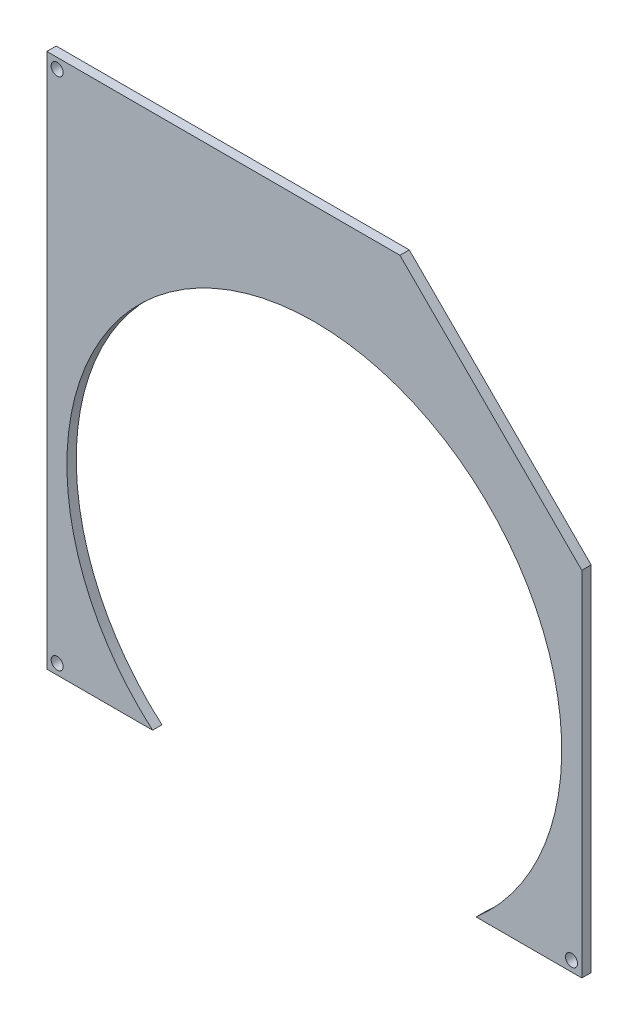
ISO-10303-21;
HEADER;
FILE_DESCRIPTION(('STEP AP214'),'2;1');
FILE_NAME('part.step','',(''),(''),'','','');
FILE_SCHEMA(('AUTOMOTIVE_DESIGN { 1 0 10303 214 1 1 1 1 }'));
ENDSEC;
DATA;
#1=APPLICATION_CONTEXT('core data for automotive mechanical design processes');
#2=APPLICATION_PROTOCOL_DEFINITION('international standard','automotive_design',2000,#1);
#3=PRODUCT_CONTEXT('',#1,'mechanical');
#4=PRODUCT('Part','Part','',(#3));
#5=PRODUCT_RELATED_PRODUCT_CATEGORY('part','',(#4));
#6=PRODUCT_DEFINITION_FORMATION('','',#4);
#7=PRODUCT_DEFINITION_CONTEXT('part definition',#1,'design');
#8=PRODUCT_DEFINITION('design','',#6,#7);
#9=PRODUCT_DEFINITION_SHAPE('','',#8);
#10=(LENGTH_UNIT() NAMED_UNIT(*) SI_UNIT(.MILLI.,.METRE.));
#11=(NAMED_UNIT(*) PLANE_ANGLE_UNIT() SI_UNIT($,.RADIAN.));
#12=(NAMED_UNIT(*) SI_UNIT($,.STERADIAN.) SOLID_ANGLE_UNIT());
#13=UNCERTAINTY_MEASURE_WITH_UNIT(LENGTH_MEASURE(1.E-05),#10,'distance_accuracy_value','');
#14=(GEOMETRIC_REPRESENTATION_CONTEXT(3) GLOBAL_UNCERTAINTY_ASSIGNED_CONTEXT((#13)) GLOBAL_UNIT_ASSIGNED_CONTEXT((#10,
#11,#12)) REPRESENTATION_CONTEXT('',''));
#15=CARTESIAN_POINT('',(0.,0.,0.));
#16=DIRECTION('',(0.,0.,1.));
#17=DIRECTION('',(1.,0.,0.));
#18=AXIS2_PLACEMENT_3D('',#15,#16,#17);
#19=CARTESIAN_POINT('',(0.,-30.,3.5));
#20=DIRECTION('',(0.,0.,-1.));
#21=DIRECTION('',(-1.,0.,0.));
#22=AXIS2_PLACEMENT_3D('',#19,#20,#21);
#23=CYLINDRICAL_SURFACE('',#22,92.5);
#24=CARTESIAN_POINT('',(0.,-30.,0.));
#25=DIRECTION('',(0.,0.,1.));
#26=DIRECTION('',(1.,0.,0.));
#27=AXIS2_PLACEMENT_3D('',#24,#25,#26);
#28=CIRCLE('',#27,92.5);
#29=CARTESIAN_POINT('',(60.4669331122391,-100.,0.));
#30=VERTEX_POINT('',#29);
#31=CARTESIAN_POINT('',(-60.4669331122391,-100.,0.));
#32=VERTEX_POINT('',#31);
#33=EDGE_CURVE('E134',#30,#32,#28,.T.);
#34=ORIENTED_EDGE('',*,*,#33,.F.);
#35=DIRECTION('',(0.,0.,-1.));
#36=VECTOR('',#35,1.);
#37=CARTESIAN_POINT('',(60.4669331122391,-100.,3.5));
#38=LINE('',#37,#36);
#39=CARTESIAN_POINT('',(60.4669331122391,-100.,3.5));
#40=VERTEX_POINT('',#39);
#41=EDGE_CURVE('E11',#40,#30,#38,.T.);
#42=ORIENTED_EDGE('',*,*,#41,.F.);
#43=CARTESIAN_POINT('',(0.,-30.,3.5));
#44=DIRECTION('',(0.,0.,1.));
#45=DIRECTION('',(1.,0.,0.));
#46=AXIS2_PLACEMENT_3D('',#43,#44,#45);
#47=CIRCLE('',#46,92.5);
#48=CARTESIAN_POINT('',(-60.4669331122391,-100.,3.5));
#49=VERTEX_POINT('',#48);
#50=EDGE_CURVE('E158',#40,#49,#47,.T.);
#51=ORIENTED_EDGE('',*,*,#50,.T.);
#52=DIRECTION('',(0.,0.,-1.));
#53=VECTOR('',#52,1.);
#54=CARTESIAN_POINT('',(-60.4669331122391,-100.,3.5));
#55=LINE('',#54,#53);
#56=EDGE_CURVE('E83',#49,#32,#55,.T.);
#57=ORIENTED_EDGE('',*,*,#56,.T.);
#58=EDGE_LOOP('',(#34,#42,#51,#57));
#59=FACE_BOUND('',#58,.T.);
#60=ADVANCED_FACE('F36',(#59),#23,.F.);
#61=CARTESIAN_POINT('',(0.,-100.,3.5));
#62=DIRECTION('',(0.,1.,0.));
#63=DIRECTION('',(0.,0.,1.));
#64=AXIS2_PLACEMENT_3D('',#61,#62,#63);
#65=PLANE('',#64);
#66=DIRECTION('',(1.,0.,0.));
#67=VECTOR('',#66,1.);
#68=CARTESIAN_POINT('',(0.,-100.,0.));
#69=LINE('',#68,#67);
#70=CARTESIAN_POINT('',(100.,-100.,0.));
#71=VERTEX_POINT('',#70);
#72=EDGE_CURVE('E137',#30,#71,#69,.T.);
#73=ORIENTED_EDGE('',*,*,#72,.T.);
#74=DIRECTION('',(0.,0.,-1.));
#75=VECTOR('',#74,1.);
#76=CARTESIAN_POINT('',(100.,-100.,3.5));
#77=LINE('',#76,#75);
#78=CARTESIAN_POINT('',(100.,-100.,3.5));
#79=VERTEX_POINT('',#78);
#80=EDGE_CURVE('E44',#79,#71,#77,.T.);
#81=ORIENTED_EDGE('',*,*,#80,.F.);
#82=DIRECTION('',(1.,0.,0.));
#83=VECTOR('',#82,1.);
#84=CARTESIAN_POINT('',(0.,-100.,3.5));
#85=LINE('',#84,#83);
#86=EDGE_CURVE('E123',#40,#79,#85,.T.);
#87=ORIENTED_EDGE('',*,*,#86,.F.);
#88=ORIENTED_EDGE('',*,*,#41,.T.);
#89=EDGE_LOOP('',(#73,#81,#87,#88));
#90=FACE_BOUND('',#89,.T.);
#91=ADVANCED_FACE('F181',(#90),#65,.F.);
#92=CARTESIAN_POINT('',(100.,0.,3.5));
#93=DIRECTION('',(-1.,0.,0.));
#94=DIRECTION('',(0.,0.,1.));
#95=AXIS2_PLACEMENT_3D('',#92,#93,#94);
#96=PLANE('',#95);
#97=DIRECTION('',(0.,1.,0.));
#98=VECTOR('',#97,1.);
#99=CARTESIAN_POINT('',(100.,0.,0.));
#100=LINE('',#99,#98);
#101=CARTESIAN_POINT('',(100.,31.9999999999993,0.));
#102=VERTEX_POINT('',#101);
#103=EDGE_CURVE('E139',#71,#102,#100,.T.);
#104=ORIENTED_EDGE('',*,*,#103,.T.);
#105=DIRECTION('',(0.,0.,-1.));
#106=VECTOR('',#105,1.);
#107=CARTESIAN_POINT('',(100.,31.9999999999993,3.5));
#108=LINE('',#107,#106);
#109=CARTESIAN_POINT('',(100.,31.9999999999993,3.5));
#110=VERTEX_POINT('',#109);
#111=EDGE_CURVE('E162',#110,#102,#108,.T.);
#112=ORIENTED_EDGE('',*,*,#111,.F.);
#113=DIRECTION('',(0.,1.,0.));
#114=VECTOR('',#113,1.);
#115=CARTESIAN_POINT('',(100.,0.,3.5));
#116=LINE('',#115,#114);
#117=EDGE_CURVE('E170',#79,#110,#116,.T.);
#118=ORIENTED_EDGE('',*,*,#117,.F.);
#119=ORIENTED_EDGE('',*,*,#80,.T.);
#120=EDGE_LOOP('',(#104,#112,#118,#119));
#121=FACE_BOUND('',#120,.T.);
#122=ADVANCED_FACE('F168',(#121),#96,.F.);
#123=CARTESIAN_POINT('',(66.0000000000002,65.9999999999995,3.5));
#124=DIRECTION('',(0.707106781186551,0.707106781186544,0.));
#125=DIRECTION('',(-0.707106781186544,0.707106781186551,0.));
#126=AXIS2_PLACEMENT_3D('',#123,#124,#125);
#127=PLANE('',#126);
#128=DIRECTION('',(0.707106781186544,-0.707106781186551,0.));
#129=VECTOR('',#128,1.);
#130=CARTESIAN_POINT('',(66.0000000000002,65.9999999999995,0.));
#131=LINE('',#130,#129);
#132=CARTESIAN_POINT('',(32.,100.,0.));
#133=VERTEX_POINT('',#132);
#134=EDGE_CURVE('E143',#133,#102,#131,.T.);
#135=ORIENTED_EDGE('',*,*,#134,.F.);
#136=DIRECTION('',(0.,0.,-1.));
#137=VECTOR('',#136,1.);
#138=CARTESIAN_POINT('',(32.,100.,3.5));
#139=LINE('',#138,#137);
#140=CARTESIAN_POINT('',(32.,100.,3.5));
#141=VERTEX_POINT('',#140);
#142=EDGE_CURVE('E110',#141,#133,#139,.T.);
#143=ORIENTED_EDGE('',*,*,#142,.F.);
#144=DIRECTION('',(0.707106781186544,-0.707106781186551,0.));
#145=VECTOR('',#144,1.);
#146=CARTESIAN_POINT('',(66.0000000000002,65.9999999999995,3.5));
#147=LINE('',#146,#145);
#148=EDGE_CURVE('E117',#141,#110,#147,.T.);
#149=ORIENTED_EDGE('',*,*,#148,.T.);
#150=ORIENTED_EDGE('',*,*,#111,.T.);
#151=EDGE_LOOP('',(#135,#143,#149,#150));
#152=FACE_BOUND('',#151,.T.);
#153=ADVANCED_FACE('F178',(#152),#127,.T.);
#154=CARTESIAN_POINT('',(0.,100.,3.5));
#155=DIRECTION('',(0.,1.,0.));
#156=DIRECTION('',(0.,0.,1.));
#157=AXIS2_PLACEMENT_3D('',#154,#155,#156);
#158=PLANE('',#157);
#159=DIRECTION('',(1.,0.,0.));
#160=VECTOR('',#159,1.);
#161=CARTESIAN_POINT('',(0.,100.,0.));
#162=LINE('',#161,#160);
#163=CARTESIAN_POINT('',(-100.,100.,0.));
#164=VERTEX_POINT('',#163);
#165=EDGE_CURVE('E105',#164,#133,#162,.T.);
#166=ORIENTED_EDGE('',*,*,#165,.F.);
#167=DIRECTION('',(0.,0.,-1.));
#168=VECTOR('',#167,1.);
#169=CARTESIAN_POINT('',(-100.,100.,3.5));
#170=LINE('',#169,#168);
#171=CARTESIAN_POINT('',(-100.,100.,3.5));
#172=VERTEX_POINT('',#171);
#173=EDGE_CURVE('E100',#172,#164,#170,.T.);
#174=ORIENTED_EDGE('',*,*,#173,.F.);
#175=DIRECTION('',(1.,0.,0.));
#176=VECTOR('',#175,1.);
#177=CARTESIAN_POINT('',(0.,100.,3.5));
#178=LINE('',#177,#176);
#179=EDGE_CURVE('E103',#172,#141,#178,.T.);
#180=ORIENTED_EDGE('',*,*,#179,.T.);
#181=ORIENTED_EDGE('',*,*,#142,.T.);
#182=EDGE_LOOP('',(#166,#174,#180,#181));
#183=FACE_BOUND('',#182,.T.);
#184=ADVANCED_FACE('F102',(#183),#158,.T.);
#185=CARTESIAN_POINT('',(-100.,0.,3.5));
#186=DIRECTION('',(-1.,0.,0.));
#187=DIRECTION('',(0.,0.,1.));
#188=AXIS2_PLACEMENT_3D('',#185,#186,#187);
#189=PLANE('',#188);
#190=DIRECTION('',(0.,1.,0.));
#191=VECTOR('',#190,1.);
#192=CARTESIAN_POINT('',(-100.,0.,0.));
#193=LINE('',#192,#191);
#194=CARTESIAN_POINT('',(-100.,-100.,0.));
#195=VERTEX_POINT('',#194);
#196=EDGE_CURVE('E147',#195,#164,#193,.T.);
#197=ORIENTED_EDGE('',*,*,#196,.F.);
#198=DIRECTION('',(0.,0.,-1.));
#199=VECTOR('',#198,1.);
#200=CARTESIAN_POINT('',(-100.,-100.,3.5));
#201=LINE('',#200,#199);
#202=CARTESIAN_POINT('',(-100.,-100.,3.5));
#203=VERTEX_POINT('',#202);
#204=EDGE_CURVE('E76',#203,#195,#201,.T.);
#205=ORIENTED_EDGE('',*,*,#204,.F.);
#206=DIRECTION('',(0.,1.,0.));
#207=VECTOR('',#206,1.);
#208=CARTESIAN_POINT('',(-100.,0.,3.5));
#209=LINE('',#208,#207);
#210=EDGE_CURVE('E115',#203,#172,#209,.T.);
#211=ORIENTED_EDGE('',*,*,#210,.T.);
#212=ORIENTED_EDGE('',*,*,#173,.T.);
#213=EDGE_LOOP('',(#197,#205,#211,#212));
#214=FACE_BOUND('',#213,.T.);
#215=ADVANCED_FACE('F119',(#214),#189,.T.);
#216=CARTESIAN_POINT('',(96.1500000000001,-96.15,3.5));
#217=DIRECTION('',(0.,0.,-1.));
#218=DIRECTION('',(-1.,0.,0.));
#219=AXIS2_PLACEMENT_3D('',#216,#217,#218);
#220=CYLINDRICAL_SURFACE('',#219,2.25);
#221=CARTESIAN_POINT('',(96.1500000000001,-96.15,3.5));
#222=DIRECTION('',(0.,0.,1.));
#223=DIRECTION('',(1.,0.,0.));
#224=AXIS2_PLACEMENT_3D('',#221,#222,#223);
#225=CIRCLE('',#224,2.25);
#226=CARTESIAN_POINT('',(98.4000000000001,-96.15,3.5));
#227=VERTEX_POINT('',#226);
#228=EDGE_CURVE('E128',#227,#227,#225,.T.);
#229=ORIENTED_EDGE('',*,*,#228,.T.);
#230=EDGE_LOOP('',(#229));
#231=FACE_BOUND('',#230,.T.);
#232=CARTESIAN_POINT('',(96.1500000000001,-96.15,0.));
#233=DIRECTION('',(0.,0.,1.));
#234=DIRECTION('',(1.,0.,0.));
#235=AXIS2_PLACEMENT_3D('',#232,#233,#234);
#236=CIRCLE('',#235,2.25);
#237=CARTESIAN_POINT('',(98.4000000000001,-96.15,0.));
#238=VERTEX_POINT('',#237);
#239=EDGE_CURVE('E152',#238,#238,#236,.T.);
#240=ORIENTED_EDGE('',*,*,#239,.F.);
#241=EDGE_LOOP('',(#240));
#242=FACE_BOUND('',#241,.T.);
#243=ADVANCED_FACE('F200',(#231,#242),#220,.F.);
#244=CARTESIAN_POINT('',(-96.15,96.15,3.5));
#245=DIRECTION('',(0.,0.,-1.));
#246=DIRECTION('',(-1.,0.,0.));
#247=AXIS2_PLACEMENT_3D('',#244,#245,#246);
#248=CYLINDRICAL_SURFACE('',#247,2.25);
#249=CARTESIAN_POINT('',(-96.15,96.15,3.5));
#250=DIRECTION('',(0.,0.,1.));
#251=DIRECTION('',(1.,0.,0.));
#252=AXIS2_PLACEMENT_3D('',#249,#250,#251);
#253=CIRCLE('',#252,2.25);
#254=CARTESIAN_POINT('',(-93.9,96.15,3.5));
#255=VERTEX_POINT('',#254);
#256=EDGE_CURVE('E121',#255,#255,#253,.T.);
#257=ORIENTED_EDGE('',*,*,#256,.T.);
#258=EDGE_LOOP('',(#257));
#259=FACE_BOUND('',#258,.T.);
#260=CARTESIAN_POINT('',(-96.15,96.15,0.));
#261=DIRECTION('',(0.,0.,1.));
#262=DIRECTION('',(1.,0.,0.));
#263=AXIS2_PLACEMENT_3D('',#260,#261,#262);
#264=CIRCLE('',#263,2.25);
#265=CARTESIAN_POINT('',(-93.9,96.15,0.));
#266=VERTEX_POINT('',#265);
#267=EDGE_CURVE('E149',#266,#266,#264,.T.);
#268=ORIENTED_EDGE('',*,*,#267,.F.);
#269=EDGE_LOOP('',(#268));
#270=FACE_BOUND('',#269,.T.);
#271=ADVANCED_FACE('F193',(#259,#270),#248,.F.);
#272=EDGE_CURVE('E140',#195,#32,#69,.T.);
#273=ORIENTED_EDGE('',*,*,#272,.T.);
#274=ORIENTED_EDGE('',*,*,#56,.F.);
#275=EDGE_CURVE('E52',#203,#49,#85,.T.);
#276=ORIENTED_EDGE('',*,*,#275,.F.);
#277=ORIENTED_EDGE('',*,*,#204,.T.);
#278=EDGE_LOOP('',(#273,#274,#276,#277));
#279=FACE_BOUND('',#278,.T.);
#280=ADVANCED_FACE('F184',(#279),#65,.F.);
#281=CARTESIAN_POINT('',(-96.15,-96.15,3.5));
#282=DIRECTION('',(0.,0.,-1.));
#283=DIRECTION('',(-1.,0.,0.));
#284=AXIS2_PLACEMENT_3D('',#281,#282,#283);
#285=CYLINDRICAL_SURFACE('',#284,2.25);
#286=CARTESIAN_POINT('',(-96.15,-96.15,3.5));
#287=DIRECTION('',(0.,0.,1.));
#288=DIRECTION('',(1.,0.,0.));
#289=AXIS2_PLACEMENT_3D('',#286,#287,#288);
#290=CIRCLE('',#289,2.25);
#291=CARTESIAN_POINT('',(-93.9,-96.15,3.5));
#292=VERTEX_POINT('',#291);
#293=EDGE_CURVE('E131',#292,#292,#290,.F.);
#294=ORIENTED_EDGE('',*,*,#293,.F.);
#295=EDGE_LOOP('',(#294));
#296=FACE_BOUND('',#295,.T.);
#297=CARTESIAN_POINT('',(-96.15,-96.15,0.));
#298=DIRECTION('',(0.,0.,1.));
#299=DIRECTION('',(1.,0.,0.));
#300=AXIS2_PLACEMENT_3D('',#297,#298,#299);
#301=CIRCLE('',#300,2.25);
#302=CARTESIAN_POINT('',(-93.9,-96.15,0.));
#303=VERTEX_POINT('',#302);
#304=EDGE_CURVE('E155',#303,#303,#301,.F.);
#305=ORIENTED_EDGE('',*,*,#304,.T.);
#306=EDGE_LOOP('',(#305));
#307=FACE_BOUND('',#306,.T.);
#308=ADVANCED_FACE('F192',(#296,#307),#285,.F.);
#309=CARTESIAN_POINT('',(0.,0.,3.5));
#310=DIRECTION('',(0.,0.,1.));
#311=DIRECTION('',(1.,0.,0.));
#312=AXIS2_PLACEMENT_3D('',#309,#310,#311);
#313=PLANE('',#312);
#314=ORIENTED_EDGE('',*,*,#50,.F.);
#315=ORIENTED_EDGE('',*,*,#86,.T.);
#316=ORIENTED_EDGE('',*,*,#117,.T.);
#317=ORIENTED_EDGE('',*,*,#148,.F.);
#318=ORIENTED_EDGE('',*,*,#179,.F.);
#319=ORIENTED_EDGE('',*,*,#210,.F.);
#320=ORIENTED_EDGE('',*,*,#275,.T.);
#321=EDGE_LOOP('',(#314,#315,#316,#317,#318,#319,#320));
#322=FACE_BOUND('',#321,.T.);
#323=ORIENTED_EDGE('',*,*,#256,.F.);
#324=EDGE_LOOP('',(#323));
#325=FACE_BOUND('',#324,.T.);
#326=ORIENTED_EDGE('',*,*,#228,.F.);
#327=EDGE_LOOP('',(#326));
#328=FACE_BOUND('',#327,.T.);
#329=ORIENTED_EDGE('',*,*,#293,.T.);
#330=EDGE_LOOP('',(#329));
#331=FACE_BOUND('',#330,.T.);
#332=ADVANCED_FACE('F113',(#322,#325,#328,#331),#313,.T.);
#333=CARTESIAN_POINT('',(0.,0.,0.));
#334=DIRECTION('',(0.,0.,1.));
#335=DIRECTION('',(1.,0.,0.));
#336=AXIS2_PLACEMENT_3D('',#333,#334,#335);
#337=PLANE('',#336);
#338=ORIENTED_EDGE('',*,*,#33,.T.);
#339=ORIENTED_EDGE('',*,*,#272,.F.);
#340=ORIENTED_EDGE('',*,*,#196,.T.);
#341=ORIENTED_EDGE('',*,*,#165,.T.);
#342=ORIENTED_EDGE('',*,*,#134,.T.);
#343=ORIENTED_EDGE('',*,*,#103,.F.);
#344=ORIENTED_EDGE('',*,*,#72,.F.);
#345=EDGE_LOOP('',(#338,#339,#340,#341,#342,#343,#344));
#346=FACE_BOUND('',#345,.T.);
#347=ORIENTED_EDGE('',*,*,#267,.T.);
#348=EDGE_LOOP('',(#347));
#349=FACE_BOUND('',#348,.T.);
#350=ORIENTED_EDGE('',*,*,#239,.T.);
#351=EDGE_LOOP('',(#350));
#352=FACE_BOUND('',#351,.T.);
#353=ORIENTED_EDGE('',*,*,#304,.F.);
#354=EDGE_LOOP('',(#353));
#355=FACE_BOUND('',#354,.T.);
#356=ADVANCED_FACE('F174',(#346,#349,#352,#355),#337,.F.);
#357=CLOSED_SHELL('',(#60,#91,#122,#153,#184,#215,#243,#271,#280,#308,#332,#356));
#358=MANIFOLD_SOLID_BREP('B2',#357);
#359=ADVANCED_BREP_SHAPE_REPRESENTATION('',(#18,#358),#14);
#360=SHAPE_DEFINITION_REPRESENTATION(#9,#359);
ENDSEC;
END-ISO-10303-21;
